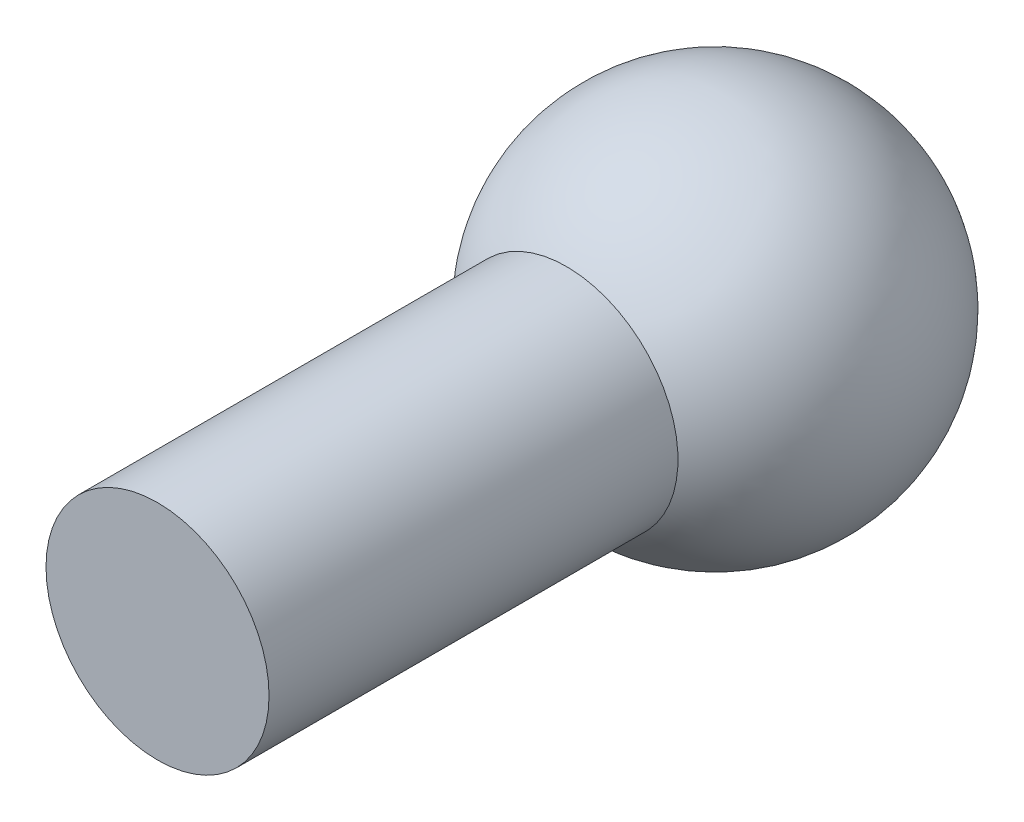
ISO-10303-21;
HEADER;
FILE_DESCRIPTION(('STEP AP214'),'2;1');
FILE_NAME('part.step','',(''),(''),'','','');
FILE_SCHEMA(('AUTOMOTIVE_DESIGN { 1 0 10303 214 1 1 1 1 }'));
ENDSEC;
DATA;
#1=APPLICATION_CONTEXT('core data for automotive mechanical design processes');
#2=APPLICATION_PROTOCOL_DEFINITION('international standard','automotive_design',2000,#1);
#3=PRODUCT_CONTEXT('',#1,'mechanical');
#4=PRODUCT('Part','Part','',(#3));
#5=PRODUCT_RELATED_PRODUCT_CATEGORY('part','',(#4));
#6=PRODUCT_DEFINITION_FORMATION('','',#4);
#7=PRODUCT_DEFINITION_CONTEXT('part definition',#1,'design');
#8=PRODUCT_DEFINITION('design','',#6,#7);
#9=PRODUCT_DEFINITION_SHAPE('','',#8);
#10=(LENGTH_UNIT() NAMED_UNIT(*) SI_UNIT(.MILLI.,.METRE.));
#11=(NAMED_UNIT(*) PLANE_ANGLE_UNIT() SI_UNIT($,.RADIAN.));
#12=(NAMED_UNIT(*) SI_UNIT($,.STERADIAN.) SOLID_ANGLE_UNIT());
#13=UNCERTAINTY_MEASURE_WITH_UNIT(LENGTH_MEASURE(1.E-05),#10,'distance_accuracy_value','');
#14=(GEOMETRIC_REPRESENTATION_CONTEXT(3) GLOBAL_UNCERTAINTY_ASSIGNED_CONTEXT((#13)) GLOBAL_UNIT_ASSIGNED_CONTEXT((#10,
#11,#12)) REPRESENTATION_CONTEXT('',''));
#15=CARTESIAN_POINT('',(0.,0.,0.));
#16=DIRECTION('',(0.,0.,1.));
#17=DIRECTION('',(1.,0.,0.));
#18=AXIS2_PLACEMENT_3D('',#15,#16,#17);
#19=CARTESIAN_POINT('',(0.,0.,0.));
#20=DIRECTION('',(0.,-1.,0.));
#21=DIRECTION('',(-1.,0.,0.));
#22=AXIS2_PLACEMENT_3D('',#19,#20,#21);
#23=SPHERICAL_SURFACE('',#22,5.);
#24=CARTESIAN_POINT('',(0.,0.,0.));
#25=DIRECTION('',(0.,0.,-1.));
#26=DIRECTION('',(-1.,0.,0.));
#27=AXIS2_PLACEMENT_3D('',#24,#25,#26);
#28=SPHERICAL_SURFACE('',#27,5.);
#29=CARTESIAN_POINT('',(0.,0.,4.));
#30=DIRECTION('',(0.,0.,-1.));
#31=DIRECTION('',(-1.,0.,0.));
#32=AXIS2_PLACEMENT_3D('',#29,#30,#31);
#33=CIRCLE('',#32,3.);
#34=CARTESIAN_POINT('',(-3.,0.,4.));
#35=VERTEX_POINT('',#34);
#36=EDGE_CURVE('E10',#35,#35,#33,.F.);
#37=ORIENTED_EDGE('',*,*,#36,.F.);
#38=EDGE_LOOP('',(#37));
#39=FACE_BOUND('',#38,.T.);
#40=ADVANCED_FACE('F28',(#39),#28,.T.);
#41=CARTESIAN_POINT('',(0.,0.,15.));
#42=DIRECTION('',(0.,0.,-1.));
#43=DIRECTION('',(-1.,0.,0.));
#44=AXIS2_PLACEMENT_3D('',#41,#42,#43);
#45=CYLINDRICAL_SURFACE('',#44,3.);
#46=CARTESIAN_POINT('',(0.,0.,15.));
#47=DIRECTION('',(0.,0.,1.));
#48=DIRECTION('',(1.,0.,0.));
#49=AXIS2_PLACEMENT_3D('',#46,#47,#48);
#50=CIRCLE('',#49,3.);
#51=CARTESIAN_POINT('',(3.,0.,15.));
#52=VERTEX_POINT('',#51);
#53=EDGE_CURVE('E34',#52,#52,#50,.T.);
#54=ORIENTED_EDGE('',*,*,#53,.F.);
#55=EDGE_LOOP('',(#54));
#56=FACE_BOUND('',#55,.T.);
#57=ORIENTED_EDGE('',*,*,#36,.T.);
#58=EDGE_LOOP('',(#57));
#59=FACE_BOUND('',#58,.T.);
#60=ADVANCED_FACE('F42',(#56,#59),#45,.T.);
#61=CARTESIAN_POINT('',(0.,0.,15.));
#62=DIRECTION('',(0.,0.,1.));
#63=DIRECTION('',(1.,0.,0.));
#64=AXIS2_PLACEMENT_3D('',#61,#62,#63);
#65=PLANE('',#64);
#66=ORIENTED_EDGE('',*,*,#53,.T.);
#67=EDGE_LOOP('',(#66));
#68=FACE_BOUND('',#67,.T.);
#69=ADVANCED_FACE('F40',(#68),#65,.T.);
#70=CLOSED_SHELL('',(#40,#60,#69));
#71=MANIFOLD_SOLID_BREP('B2',#70);
#72=ADVANCED_BREP_SHAPE_REPRESENTATION('',(#18,#71),#14);
#73=SHAPE_DEFINITION_REPRESENTATION(#9,#72);
ENDSEC;
END-ISO-10303-21;
